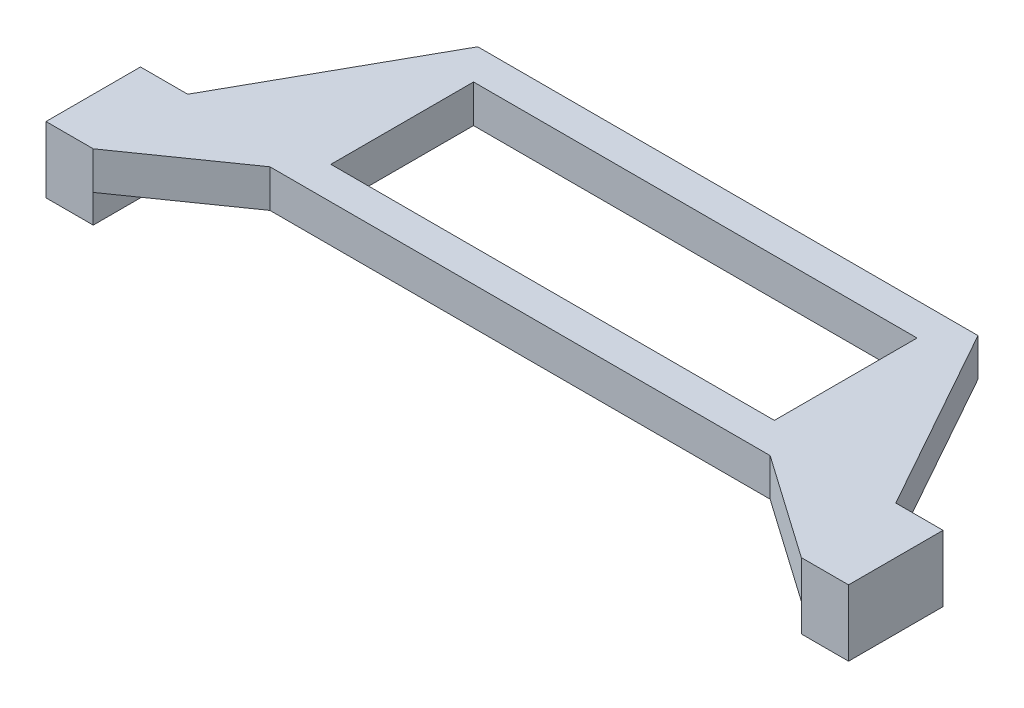
ISO-10303-21;
HEADER;
FILE_DESCRIPTION(('STEP AP214'),'2;1');
FILE_NAME('part.step','',(''),(''),'','','');
FILE_SCHEMA(('AUTOMOTIVE_DESIGN { 1 0 10303 214 1 1 1 1 }'));
ENDSEC;
DATA;
#1=APPLICATION_CONTEXT('core data for automotive mechanical design processes');
#2=APPLICATION_PROTOCOL_DEFINITION('international standard','automotive_design',2000,#1);
#3=PRODUCT_CONTEXT('',#1,'mechanical');
#4=PRODUCT('Part','Part','',(#3));
#5=PRODUCT_RELATED_PRODUCT_CATEGORY('part','',(#4));
#6=PRODUCT_DEFINITION_FORMATION('','',#4);
#7=PRODUCT_DEFINITION_CONTEXT('part definition',#1,'design');
#8=PRODUCT_DEFINITION('design','',#6,#7);
#9=PRODUCT_DEFINITION_SHAPE('','',#8);
#10=(LENGTH_UNIT() NAMED_UNIT(*) SI_UNIT(.MILLI.,.METRE.));
#11=(NAMED_UNIT(*) PLANE_ANGLE_UNIT() SI_UNIT($,.RADIAN.));
#12=(NAMED_UNIT(*) SI_UNIT($,.STERADIAN.) SOLID_ANGLE_UNIT());
#13=UNCERTAINTY_MEASURE_WITH_UNIT(LENGTH_MEASURE(1.E-05),#10,'distance_accuracy_value','');
#14=(GEOMETRIC_REPRESENTATION_CONTEXT(3) GLOBAL_UNCERTAINTY_ASSIGNED_CONTEXT((#13)) GLOBAL_UNIT_ASSIGNED_CONTEXT((#10,
#11,#12)) REPRESENTATION_CONTEXT('',''));
#15=CARTESIAN_POINT('',(0.,0.,0.));
#16=DIRECTION('',(0.,0.,1.));
#17=DIRECTION('',(1.,0.,0.));
#18=AXIS2_PLACEMENT_3D('',#15,#16,#17);
#19=CARTESIAN_POINT('',(-37.47,7.,-10.));
#20=DIRECTION('',(-1.,0.,0.));
#21=DIRECTION('',(0.,0.,1.));
#22=AXIS2_PLACEMENT_3D('',#19,#20,#21);
#23=PLANE('',#22);
#24=DIRECTION('',(0.,0.,-1.));
#25=VECTOR('',#24,1.);
#26=CARTESIAN_POINT('',(-37.47,3.,0.));
#27=LINE('',#26,#25);
#28=CARTESIAN_POINT('',(-37.47,3.,0.));
#29=VERTEX_POINT('',#28);
#30=CARTESIAN_POINT('',(-37.47,3.,-10.));
#31=VERTEX_POINT('',#30);
#32=EDGE_CURVE('E52',#29,#31,#27,.T.);
#33=ORIENTED_EDGE('',*,*,#32,.F.);
#34=DIRECTION('',(0.,-1.,0.));
#35=VECTOR('',#34,1.);
#36=CARTESIAN_POINT('',(-37.47,7.,0.));
#37=LINE('',#36,#35);
#38=CARTESIAN_POINT('',(-37.47,0.,0.));
#39=VERTEX_POINT('',#38);
#40=EDGE_CURVE('E258',#29,#39,#37,.T.);
#41=ORIENTED_EDGE('',*,*,#40,.T.);
#42=DIRECTION('',(0.,0.,-1.));
#43=VECTOR('',#42,1.);
#44=CARTESIAN_POINT('',(-37.47,0.,-10.));
#45=LINE('',#44,#43);
#46=CARTESIAN_POINT('',(-37.47,0.,-10.));
#47=VERTEX_POINT('',#46);
#48=EDGE_CURVE('E244',#39,#47,#45,.T.);
#49=ORIENTED_EDGE('',*,*,#48,.T.);
#50=DIRECTION('',(0.,-1.,0.));
#51=VECTOR('',#50,1.);
#52=CARTESIAN_POINT('',(-37.47,7.,-10.));
#53=LINE('',#52,#51);
#54=EDGE_CURVE('E249',#31,#47,#53,.T.);
#55=ORIENTED_EDGE('',*,*,#54,.F.);
#56=EDGE_LOOP('',(#33,#41,#49,#55));
#57=FACE_BOUND('',#56,.T.);
#58=ADVANCED_FACE('F35',(#57),#23,.F.);
#59=CARTESIAN_POINT('',(-42.47,7.,-10.));
#60=DIRECTION('',(1.,0.,0.));
#61=DIRECTION('',(0.,0.,-1.));
#62=AXIS2_PLACEMENT_3D('',#59,#60,#61);
#63=PLANE('',#62);
#64=DIRECTION('',(0.,0.,1.));
#65=VECTOR('',#64,1.);
#66=CARTESIAN_POINT('',(-42.47,0.,-10.));
#67=LINE('',#66,#65);
#68=CARTESIAN_POINT('',(-42.47,0.,-10.));
#69=VERTEX_POINT('',#68);
#70=CARTESIAN_POINT('',(-42.47,0.,0.));
#71=VERTEX_POINT('',#70);
#72=EDGE_CURVE('E218',#69,#71,#67,.T.);
#73=ORIENTED_EDGE('',*,*,#72,.T.);
#74=DIRECTION('',(0.,-1.,0.));
#75=VECTOR('',#74,1.);
#76=CARTESIAN_POINT('',(-42.47,7.,0.));
#77=LINE('',#76,#75);
#78=CARTESIAN_POINT('',(-42.47,7.,0.));
#79=VERTEX_POINT('',#78);
#80=EDGE_CURVE('E11',#79,#71,#77,.T.);
#81=ORIENTED_EDGE('',*,*,#80,.F.);
#82=DIRECTION('',(0.,0.,1.));
#83=VECTOR('',#82,1.);
#84=CARTESIAN_POINT('',(-42.47,7.,-10.));
#85=LINE('',#84,#83);
#86=CARTESIAN_POINT('',(-42.47,7.,-10.));
#87=VERTEX_POINT('',#86);
#88=EDGE_CURVE('E234',#87,#79,#85,.T.);
#89=ORIENTED_EDGE('',*,*,#88,.F.);
#90=DIRECTION('',(0.,-1.,0.));
#91=VECTOR('',#90,1.);
#92=CARTESIAN_POINT('',(-42.47,7.,-10.));
#93=LINE('',#92,#91);
#94=EDGE_CURVE('E238',#87,#69,#93,.T.);
#95=ORIENTED_EDGE('',*,*,#94,.T.);
#96=EDGE_LOOP('',(#73,#81,#89,#95));
#97=FACE_BOUND('',#96,.T.);
#98=ADVANCED_FACE('F37',(#97),#63,.F.);
#99=CARTESIAN_POINT('',(-42.47,7.,0.));
#100=DIRECTION('',(0.,0.,-1.));
#101=DIRECTION('',(-1.,0.,0.));
#102=AXIS2_PLACEMENT_3D('',#99,#100,#101);
#103=PLANE('',#102);
#104=DIRECTION('',(1.,0.,0.));
#105=VECTOR('',#104,1.);
#106=CARTESIAN_POINT('',(-42.47,0.,0.));
#107=LINE('',#106,#105);
#108=EDGE_CURVE('E241',#71,#39,#107,.T.);
#109=ORIENTED_EDGE('',*,*,#108,.T.);
#110=ORIENTED_EDGE('',*,*,#40,.F.);
#111=CARTESIAN_POINT('',(-37.47,7.,0.));
#112=VERTEX_POINT('',#111);
#113=EDGE_CURVE('E44',#112,#29,#37,.T.);
#114=ORIENTED_EDGE('',*,*,#113,.F.);
#115=DIRECTION('',(1.,0.,0.));
#116=VECTOR('',#115,1.);
#117=CARTESIAN_POINT('',(-42.47,7.,0.));
#118=LINE('',#117,#116);
#119=EDGE_CURVE('E87',#79,#112,#118,.T.);
#120=ORIENTED_EDGE('',*,*,#119,.F.);
#121=ORIENTED_EDGE('',*,*,#80,.T.);
#122=EDGE_LOOP('',(#109,#110,#114,#120,#121));
#123=FACE_BOUND('',#122,.T.);
#124=ADVANCED_FACE('F396',(#123),#103,.F.);
#125=CARTESIAN_POINT('',(-42.47,7.,-10.));
#126=DIRECTION('',(0.,0.,1.));
#127=DIRECTION('',(1.,0.,0.));
#128=AXIS2_PLACEMENT_3D('',#125,#126,#127);
#129=PLANE('',#128);
#130=DIRECTION('',(-1.,0.,0.));
#131=VECTOR('',#130,1.);
#132=CARTESIAN_POINT('',(-42.47,0.,-10.));
#133=LINE('',#132,#131);
#134=EDGE_CURVE('E80',#47,#69,#133,.T.);
#135=ORIENTED_EDGE('',*,*,#134,.T.);
#136=ORIENTED_EDGE('',*,*,#94,.F.);
#137=DIRECTION('',(-1.,0.,0.));
#138=VECTOR('',#137,1.);
#139=CARTESIAN_POINT('',(-42.47,7.,-10.));
#140=LINE('',#139,#138);
#141=CARTESIAN_POINT('',(-37.47,7.,-10.));
#142=VERTEX_POINT('',#141);
#143=EDGE_CURVE('E61',#142,#87,#140,.T.);
#144=ORIENTED_EDGE('',*,*,#143,.F.);
#145=EDGE_CURVE('E256',#142,#31,#53,.T.);
#146=ORIENTED_EDGE('',*,*,#145,.T.);
#147=ORIENTED_EDGE('',*,*,#54,.T.);
#148=EDGE_LOOP('',(#135,#136,#144,#146,#147));
#149=FACE_BOUND('',#148,.T.);
#150=ADVANCED_FACE('F399',(#149),#129,.F.);
#151=CARTESIAN_POINT('',(0.,7.,0.));
#152=DIRECTION('',(0.,1.,0.));
#153=DIRECTION('',(0.,0.,1.));
#154=AXIS2_PLACEMENT_3D('',#151,#152,#153);
#155=PLANE('',#154);
#156=ORIENTED_EDGE('',*,*,#88,.T.);
#157=ORIENTED_EDGE('',*,*,#119,.T.);
#158=DIRECTION('',(-0.819231920519031,0.,0.573462344363341));
#159=VECTOR('',#158,1.);
#160=CARTESIAN_POINT('',(-12.3223489932892,7.,-17.6033557046982));
#161=LINE('',#160,#159);
#162=CARTESIAN_POINT('',(-26.47,7.,-7.70000000000027));
#163=VERTEX_POINT('',#162);
#164=EDGE_CURVE('E211',#163,#112,#161,.T.);
#165=ORIENTED_EDGE('',*,*,#164,.F.);
#166=DIRECTION('',(-1.,0.,0.));
#167=VECTOR('',#166,1.);
#168=CARTESIAN_POINT('',(0.,7.,-7.70000000000027));
#169=LINE('',#168,#167);
#170=CARTESIAN_POINT('',(26.47,7.,-7.70000000000027));
#171=VERTEX_POINT('',#170);
#172=EDGE_CURVE('E196',#171,#163,#169,.T.);
#173=ORIENTED_EDGE('',*,*,#172,.F.);
#174=DIRECTION('',(0.819231920519031,0.,0.573462344363342));
#175=VECTOR('',#174,1.);
#176=CARTESIAN_POINT('',(12.3223489932892,7.,-17.6033557046982));
#177=LINE('',#176,#175);
#178=CARTESIAN_POINT('',(37.47,7.,0.));
#179=VERTEX_POINT('',#178);
#180=EDGE_CURVE('E186',#171,#179,#177,.T.);
#181=ORIENTED_EDGE('',*,*,#180,.T.);
#182=DIRECTION('',(1.,0.,0.));
#183=VECTOR('',#182,1.);
#184=CARTESIAN_POINT('',(37.47,7.,0.));
#185=LINE('',#184,#183);
#186=CARTESIAN_POINT('',(42.47,7.,0.));
#187=VERTEX_POINT('',#186);
#188=EDGE_CURVE('E170',#179,#187,#185,.T.);
#189=ORIENTED_EDGE('',*,*,#188,.T.);
#190=DIRECTION('',(0.,0.,-1.));
#191=VECTOR('',#190,1.);
#192=CARTESIAN_POINT('',(42.47,7.,-10.));
#193=LINE('',#192,#191);
#194=CARTESIAN_POINT('',(42.47,7.,-10.));
#195=VERTEX_POINT('',#194);
#196=EDGE_CURVE('E179',#187,#195,#193,.T.);
#197=ORIENTED_EDGE('',*,*,#196,.T.);
#198=DIRECTION('',(-1.,0.,0.));
#199=VECTOR('',#198,1.);
#200=CARTESIAN_POINT('',(37.47,7.,-10.));
#201=LINE('',#200,#199);
#202=CARTESIAN_POINT('',(37.47,7.,-10.));
#203=VERTEX_POINT('',#202);
#204=EDGE_CURVE('E346',#195,#203,#201,.T.);
#205=ORIENTED_EDGE('',*,*,#204,.T.);
#206=DIRECTION('',(-0.487523328524232,0.,-0.873109961084315));
#207=VECTOR('',#206,1.);
#208=CARTESIAN_POINT('',(32.8207827692551,7.,-18.3263254041524));
#209=LINE('',#208,#207);
#210=CARTESIAN_POINT('',(26.47,7.,-29.7000000000002));
#211=VERTEX_POINT('',#210);
#212=EDGE_CURVE('E197',#203,#211,#209,.T.);
#213=ORIENTED_EDGE('',*,*,#212,.T.);
#214=DIRECTION('',(-1.,0.,0.));
#215=VECTOR('',#214,1.);
#216=CARTESIAN_POINT('',(0.,7.,-29.7000000000002));
#217=LINE('',#216,#215);
#218=CARTESIAN_POINT('',(-26.47,7.,-29.7000000000002));
#219=VERTEX_POINT('',#218);
#220=EDGE_CURVE('E200',#211,#219,#217,.T.);
#221=ORIENTED_EDGE('',*,*,#220,.T.);
#222=DIRECTION('',(0.487523328524232,0.,-0.873109961084315));
#223=VECTOR('',#222,1.);
#224=CARTESIAN_POINT('',(-32.8207827692551,7.,-18.3263254041524));
#225=LINE('',#224,#223);
#226=EDGE_CURVE('E208',#142,#219,#225,.T.);
#227=ORIENTED_EDGE('',*,*,#226,.F.);
#228=ORIENTED_EDGE('',*,*,#143,.T.);
#229=EDGE_LOOP('',(#156,#157,#165,#173,#181,#189,#197,#205,#213,#221,#227,#228));
#230=FACE_BOUND('',#229,.T.);
#231=DIRECTION('',(0.,0.,1.));
#232=VECTOR('',#231,1.);
#233=CARTESIAN_POINT('',(23.47,7.,0.));
#234=LINE('',#233,#232);
#235=CARTESIAN_POINT('',(23.47,7.,-26.25));
#236=VERTEX_POINT('',#235);
#237=CARTESIAN_POINT('',(23.47,7.,-11.1500000000004));
#238=VERTEX_POINT('',#237);
#239=EDGE_CURVE('E271',#236,#238,#234,.T.);
#240=ORIENTED_EDGE('',*,*,#239,.T.);
#241=DIRECTION('',(-1.,0.,0.));
#242=VECTOR('',#241,1.);
#243=CARTESIAN_POINT('',(0.,7.,-11.1500000000004));
#244=LINE('',#243,#242);
#245=CARTESIAN_POINT('',(-23.47,7.,-11.1500000000004));
#246=VERTEX_POINT('',#245);
#247=EDGE_CURVE('E274',#238,#246,#244,.T.);
#248=ORIENTED_EDGE('',*,*,#247,.T.);
#249=DIRECTION('',(0.,0.,1.));
#250=VECTOR('',#249,1.);
#251=CARTESIAN_POINT('',(-23.47,7.,0.));
#252=LINE('',#251,#250);
#253=CARTESIAN_POINT('',(-23.47,7.,-26.25));
#254=VERTEX_POINT('',#253);
#255=EDGE_CURVE('E278',#254,#246,#252,.T.);
#256=ORIENTED_EDGE('',*,*,#255,.F.);
#257=DIRECTION('',(-1.,0.,0.));
#258=VECTOR('',#257,1.);
#259=CARTESIAN_POINT('',(0.,7.,-26.25));
#260=LINE('',#259,#258);
#261=EDGE_CURVE('E202',#236,#254,#260,.T.);
#262=ORIENTED_EDGE('',*,*,#261,.F.);
#263=EDGE_LOOP('',(#240,#248,#256,#262));
#264=FACE_BOUND('',#263,.T.);
#265=ADVANCED_FACE('F193',(#230,#264),#155,.T.);
#266=CARTESIAN_POINT('',(0.,0.,0.));
#267=DIRECTION('',(0.,1.,0.));
#268=DIRECTION('',(0.,0.,1.));
#269=AXIS2_PLACEMENT_3D('',#266,#267,#268);
#270=PLANE('',#269);
#271=ORIENTED_EDGE('',*,*,#72,.F.);
#272=ORIENTED_EDGE('',*,*,#134,.F.);
#273=ORIENTED_EDGE('',*,*,#48,.F.);
#274=ORIENTED_EDGE('',*,*,#108,.F.);
#275=EDGE_LOOP('',(#271,#272,#273,#274));
#276=FACE_BOUND('',#275,.T.);
#277=ADVANCED_FACE('F409',(#276),#270,.F.);
#278=CARTESIAN_POINT('',(0.,3.,-7.70000000000027));
#279=DIRECTION('',(0.,0.,-1.));
#280=DIRECTION('',(-1.,0.,0.));
#281=AXIS2_PLACEMENT_3D('',#278,#279,#280);
#282=PLANE('',#281);
#283=ORIENTED_EDGE('',*,*,#172,.T.);
#284=DIRECTION('',(0.,1.,0.));
#285=VECTOR('',#284,1.);
#286=CARTESIAN_POINT('',(-26.47,3.,-7.70000000000027));
#287=LINE('',#286,#285);
#288=CARTESIAN_POINT('',(-26.47,3.,-7.70000000000027));
#289=VERTEX_POINT('',#288);
#290=EDGE_CURVE('E215',#289,#163,#287,.T.);
#291=ORIENTED_EDGE('',*,*,#290,.F.);
#292=DIRECTION('',(-1.,0.,0.));
#293=VECTOR('',#292,1.);
#294=CARTESIAN_POINT('',(0.,3.,-7.70000000000027));
#295=LINE('',#294,#293);
#296=CARTESIAN_POINT('',(26.47,3.,-7.70000000000027));
#297=VERTEX_POINT('',#296);
#298=EDGE_CURVE('E308',#297,#289,#295,.T.);
#299=ORIENTED_EDGE('',*,*,#298,.F.);
#300=DIRECTION('',(0.,1.,0.));
#301=VECTOR('',#300,1.);
#302=CARTESIAN_POINT('',(26.47,3.,-7.70000000000027));
#303=LINE('',#302,#301);
#304=EDGE_CURVE('E190',#297,#171,#303,.T.);
#305=ORIENTED_EDGE('',*,*,#304,.T.);
#306=EDGE_LOOP('',(#283,#291,#299,#305));
#307=FACE_BOUND('',#306,.T.);
#308=ADVANCED_FACE('F416',(#307),#282,.F.);
#309=CARTESIAN_POINT('',(-12.3223489932892,3.,-17.6033557046982));
#310=DIRECTION('',(-0.573462344363341,0.,-0.819231920519031));
#311=DIRECTION('',(-0.819231920519031,0.,0.573462344363341));
#312=AXIS2_PLACEMENT_3D('',#309,#310,#311);
#313=PLANE('',#312);
#314=ORIENTED_EDGE('',*,*,#164,.T.);
#315=ORIENTED_EDGE('',*,*,#113,.T.);
#316=DIRECTION('',(-0.819231920519031,0.,0.573462344363341));
#317=VECTOR('',#316,1.);
#318=CARTESIAN_POINT('',(-12.3223489932892,3.,-17.6033557046982));
#319=LINE('',#318,#317);
#320=EDGE_CURVE('E233',#289,#29,#319,.T.);
#321=ORIENTED_EDGE('',*,*,#320,.F.);
#322=ORIENTED_EDGE('',*,*,#290,.T.);
#323=EDGE_LOOP('',(#314,#315,#321,#322));
#324=FACE_BOUND('',#323,.T.);
#325=ADVANCED_FACE('F412',(#324),#313,.F.);
#326=CARTESIAN_POINT('',(-32.8207827692551,3.,-18.3263254041524));
#327=DIRECTION('',(0.873109961084315,0.,0.487523328524232));
#328=DIRECTION('',(0.487523328524232,0.,-0.873109961084315));
#329=AXIS2_PLACEMENT_3D('',#326,#327,#328);
#330=PLANE('',#329);
#331=ORIENTED_EDGE('',*,*,#226,.T.);
#332=DIRECTION('',(0.,1.,0.));
#333=VECTOR('',#332,1.);
#334=CARTESIAN_POINT('',(-26.47,3.,-29.7000000000002));
#335=LINE('',#334,#333);
#336=CARTESIAN_POINT('',(-26.47,3.,-29.7000000000002));
#337=VERTEX_POINT('',#336);
#338=EDGE_CURVE('E219',#337,#219,#335,.T.);
#339=ORIENTED_EDGE('',*,*,#338,.F.);
#340=DIRECTION('',(0.487523328524232,0.,-0.873109961084315));
#341=VECTOR('',#340,1.);
#342=CARTESIAN_POINT('',(-32.8207827692551,3.,-18.3263254041524));
#343=LINE('',#342,#341);
#344=EDGE_CURVE('E264',#31,#337,#343,.T.);
#345=ORIENTED_EDGE('',*,*,#344,.F.);
#346=ORIENTED_EDGE('',*,*,#145,.F.);
#347=EDGE_LOOP('',(#331,#339,#345,#346));
#348=FACE_BOUND('',#347,.T.);
#349=ADVANCED_FACE('F341',(#348),#330,.F.);
#350=CARTESIAN_POINT('',(0.,3.,-29.7000000000002));
#351=DIRECTION('',(0.,0.,-1.));
#352=DIRECTION('',(-1.,0.,0.));
#353=AXIS2_PLACEMENT_3D('',#350,#351,#352);
#354=PLANE('',#353);
#355=ORIENTED_EDGE('',*,*,#220,.F.);
#356=DIRECTION('',(0.,1.,0.));
#357=VECTOR('',#356,1.);
#358=CARTESIAN_POINT('',(26.47,3.,-29.7000000000002));
#359=LINE('',#358,#357);
#360=CARTESIAN_POINT('',(26.47,3.,-29.7000000000002));
#361=VERTEX_POINT('',#360);
#362=EDGE_CURVE('E221',#361,#211,#359,.T.);
#363=ORIENTED_EDGE('',*,*,#362,.F.);
#364=DIRECTION('',(-1.,0.,0.));
#365=VECTOR('',#364,1.);
#366=CARTESIAN_POINT('',(0.,3.,-29.7000000000002));
#367=LINE('',#366,#365);
#368=EDGE_CURVE('E269',#361,#337,#367,.T.);
#369=ORIENTED_EDGE('',*,*,#368,.T.);
#370=ORIENTED_EDGE('',*,*,#338,.T.);
#371=EDGE_LOOP('',(#355,#363,#369,#370));
#372=FACE_BOUND('',#371,.T.);
#373=ADVANCED_FACE('F343',(#372),#354,.T.);
#374=CARTESIAN_POINT('',(32.8207827692551,3.,-18.3263254041524));
#375=DIRECTION('',(0.873109961084315,0.,-0.487523328524232));
#376=DIRECTION('',(-0.487523328524232,0.,-0.873109961084315));
#377=AXIS2_PLACEMENT_3D('',#374,#375,#376);
#378=PLANE('',#377);
#379=ORIENTED_EDGE('',*,*,#212,.F.);
#380=DIRECTION('',(0.,1.,0.));
#381=VECTOR('',#380,1.);
#382=CARTESIAN_POINT('',(37.47,3.,-10.));
#383=LINE('',#382,#381);
#384=CARTESIAN_POINT('',(37.47,3.,-10.));
#385=VERTEX_POINT('',#384);
#386=EDGE_CURVE('E189',#385,#203,#383,.T.);
#387=ORIENTED_EDGE('',*,*,#386,.F.);
#388=DIRECTION('',(-0.487523328524232,0.,-0.873109961084315));
#389=VECTOR('',#388,1.);
#390=CARTESIAN_POINT('',(32.8207827692551,3.,-18.3263254041524));
#391=LINE('',#390,#389);
#392=EDGE_CURVE('E315',#385,#361,#391,.T.);
#393=ORIENTED_EDGE('',*,*,#392,.T.);
#394=ORIENTED_EDGE('',*,*,#362,.T.);
#395=EDGE_LOOP('',(#379,#387,#393,#394));
#396=FACE_BOUND('',#395,.T.);
#397=ADVANCED_FACE('F347',(#396),#378,.T.);
#398=CARTESIAN_POINT('',(23.47,3.,0.));
#399=DIRECTION('',(-1.,0.,0.));
#400=DIRECTION('',(0.,0.,1.));
#401=AXIS2_PLACEMENT_3D('',#398,#399,#400);
#402=PLANE('',#401);
#403=ORIENTED_EDGE('',*,*,#239,.F.);
#404=DIRECTION('',(0.,1.,0.));
#405=VECTOR('',#404,1.);
#406=CARTESIAN_POINT('',(23.47,3.,-26.25));
#407=LINE('',#406,#405);
#408=CARTESIAN_POINT('',(23.47,3.,-26.25));
#409=VERTEX_POINT('',#408);
#410=EDGE_CURVE('E224',#409,#236,#407,.T.);
#411=ORIENTED_EDGE('',*,*,#410,.F.);
#412=DIRECTION('',(0.,0.,1.));
#413=VECTOR('',#412,1.);
#414=CARTESIAN_POINT('',(23.47,3.,0.));
#415=LINE('',#414,#413);
#416=CARTESIAN_POINT('',(23.47,3.,-11.1500000000004));
#417=VERTEX_POINT('',#416);
#418=EDGE_CURVE('E214',#409,#417,#415,.T.);
#419=ORIENTED_EDGE('',*,*,#418,.T.);
#420=DIRECTION('',(0.,1.,0.));
#421=VECTOR('',#420,1.);
#422=CARTESIAN_POINT('',(23.47,3.,-11.1500000000004));
#423=LINE('',#422,#421);
#424=EDGE_CURVE('E231',#417,#238,#423,.T.);
#425=ORIENTED_EDGE('',*,*,#424,.T.);
#426=EDGE_LOOP('',(#403,#411,#419,#425));
#427=FACE_BOUND('',#426,.T.);
#428=ADVANCED_FACE('F430',(#427),#402,.T.);
#429=CARTESIAN_POINT('',(0.,3.,-26.25));
#430=DIRECTION('',(0.,0.,-1.));
#431=DIRECTION('',(-1.,0.,0.));
#432=AXIS2_PLACEMENT_3D('',#429,#430,#431);
#433=PLANE('',#432);
#434=ORIENTED_EDGE('',*,*,#261,.T.);
#435=DIRECTION('',(0.,1.,0.));
#436=VECTOR('',#435,1.);
#437=CARTESIAN_POINT('',(-23.47,3.,-26.25));
#438=LINE('',#437,#436);
#439=CARTESIAN_POINT('',(-23.47,3.,-26.25));
#440=VERTEX_POINT('',#439);
#441=EDGE_CURVE('E226',#440,#254,#438,.T.);
#442=ORIENTED_EDGE('',*,*,#441,.F.);
#443=DIRECTION('',(-1.,0.,0.));
#444=VECTOR('',#443,1.);
#445=CARTESIAN_POINT('',(0.,3.,-26.25));
#446=LINE('',#445,#444);
#447=EDGE_CURVE('E302',#409,#440,#446,.T.);
#448=ORIENTED_EDGE('',*,*,#447,.F.);
#449=ORIENTED_EDGE('',*,*,#410,.T.);
#450=EDGE_LOOP('',(#434,#442,#448,#449));
#451=FACE_BOUND('',#450,.T.);
#452=ADVANCED_FACE('F283',(#451),#433,.F.);
#453=CARTESIAN_POINT('',(-23.47,3.,0.));
#454=DIRECTION('',(-1.,0.,0.));
#455=DIRECTION('',(0.,0.,1.));
#456=AXIS2_PLACEMENT_3D('',#453,#454,#455);
#457=PLANE('',#456);
#458=ORIENTED_EDGE('',*,*,#255,.T.);
#459=DIRECTION('',(0.,1.,0.));
#460=VECTOR('',#459,1.);
#461=CARTESIAN_POINT('',(-23.47,3.,-11.1500000000004));
#462=LINE('',#461,#460);
#463=CARTESIAN_POINT('',(-23.47,3.,-11.1500000000004));
#464=VERTEX_POINT('',#463);
#465=EDGE_CURVE('E229',#464,#246,#462,.T.);
#466=ORIENTED_EDGE('',*,*,#465,.F.);
#467=DIRECTION('',(0.,0.,1.));
#468=VECTOR('',#467,1.);
#469=CARTESIAN_POINT('',(-23.47,3.,0.));
#470=LINE('',#469,#468);
#471=EDGE_CURVE('E291',#440,#464,#470,.T.);
#472=ORIENTED_EDGE('',*,*,#471,.F.);
#473=ORIENTED_EDGE('',*,*,#441,.T.);
#474=EDGE_LOOP('',(#458,#466,#472,#473));
#475=FACE_BOUND('',#474,.T.);
#476=ADVANCED_FACE('F289',(#475),#457,.F.);
#477=CARTESIAN_POINT('',(0.,3.,-11.1500000000004));
#478=DIRECTION('',(0.,0.,-1.));
#479=DIRECTION('',(-1.,0.,0.));
#480=AXIS2_PLACEMENT_3D('',#477,#478,#479);
#481=PLANE('',#480);
#482=ORIENTED_EDGE('',*,*,#247,.F.);
#483=ORIENTED_EDGE('',*,*,#424,.F.);
#484=DIRECTION('',(-1.,0.,0.));
#485=VECTOR('',#484,1.);
#486=CARTESIAN_POINT('',(0.,3.,-11.1500000000004));
#487=LINE('',#486,#485);
#488=EDGE_CURVE('E297',#417,#464,#487,.T.);
#489=ORIENTED_EDGE('',*,*,#488,.T.);
#490=ORIENTED_EDGE('',*,*,#465,.T.);
#491=EDGE_LOOP('',(#482,#483,#489,#490));
#492=FACE_BOUND('',#491,.T.);
#493=ADVANCED_FACE('F294',(#492),#481,.T.);
#494=CARTESIAN_POINT('',(12.3223489932892,3.,-17.6033557046982));
#495=DIRECTION('',(-0.573462344363342,0.,0.819231920519031));
#496=DIRECTION('',(0.819231920519031,0.,0.573462344363342));
#497=AXIS2_PLACEMENT_3D('',#494,#495,#496);
#498=PLANE('',#497);
#499=ORIENTED_EDGE('',*,*,#180,.F.);
#500=ORIENTED_EDGE('',*,*,#304,.F.);
#501=DIRECTION('',(0.819231920519031,0.,0.573462344363342));
#502=VECTOR('',#501,1.);
#503=CARTESIAN_POINT('',(12.3223489932892,3.,-17.6033557046982));
#504=LINE('',#503,#502);
#505=CARTESIAN_POINT('',(37.47,3.,0.));
#506=VERTEX_POINT('',#505);
#507=EDGE_CURVE('E188',#297,#506,#504,.T.);
#508=ORIENTED_EDGE('',*,*,#507,.T.);
#509=DIRECTION('',(0.,1.,0.));
#510=VECTOR('',#509,1.);
#511=CARTESIAN_POINT('',(37.47,3.,0.));
#512=LINE('',#511,#510);
#513=EDGE_CURVE('E173',#506,#179,#512,.T.);
#514=ORIENTED_EDGE('',*,*,#513,.T.);
#515=EDGE_LOOP('',(#499,#500,#508,#514));
#516=FACE_BOUND('',#515,.T.);
#517=ADVANCED_FACE('F185',(#516),#498,.T.);
#518=CARTESIAN_POINT('',(0.,3.,0.));
#519=DIRECTION('',(0.,1.,0.));
#520=DIRECTION('',(0.,0.,1.));
#521=AXIS2_PLACEMENT_3D('',#518,#519,#520);
#522=PLANE('',#521);
#523=ORIENTED_EDGE('',*,*,#418,.F.);
#524=ORIENTED_EDGE('',*,*,#447,.T.);
#525=ORIENTED_EDGE('',*,*,#471,.T.);
#526=ORIENTED_EDGE('',*,*,#488,.F.);
#527=EDGE_LOOP('',(#523,#524,#525,#526));
#528=FACE_BOUND('',#527,.T.);
#529=ORIENTED_EDGE('',*,*,#298,.T.);
#530=ORIENTED_EDGE('',*,*,#320,.T.);
#531=ORIENTED_EDGE('',*,*,#32,.T.);
#532=ORIENTED_EDGE('',*,*,#344,.T.);
#533=ORIENTED_EDGE('',*,*,#368,.F.);
#534=ORIENTED_EDGE('',*,*,#392,.F.);
#535=DIRECTION('',(0.,0.,1.));
#536=VECTOR('',#535,1.);
#537=CARTESIAN_POINT('',(37.47,3.,0.));
#538=LINE('',#537,#536);
#539=EDGE_CURVE('E312',#385,#506,#538,.T.);
#540=ORIENTED_EDGE('',*,*,#539,.T.);
#541=ORIENTED_EDGE('',*,*,#507,.F.);
#542=EDGE_LOOP('',(#529,#530,#531,#532,#533,#534,#540,#541));
#543=FACE_BOUND('',#542,.T.);
#544=ADVANCED_FACE('F337',(#528,#543),#522,.F.);
#545=CARTESIAN_POINT('',(37.47,7.,-10.));
#546=DIRECTION('',(1.,0.,0.));
#547=DIRECTION('',(0.,0.,-1.));
#548=AXIS2_PLACEMENT_3D('',#545,#546,#547);
#549=PLANE('',#548);
#550=ORIENTED_EDGE('',*,*,#539,.F.);
#551=DIRECTION('',(0.,-1.,0.));
#552=VECTOR('',#551,1.);
#553=CARTESIAN_POINT('',(37.47,7.,-10.));
#554=LINE('',#553,#552);
#555=CARTESIAN_POINT('',(37.47,0.,-10.));
#556=VERTEX_POINT('',#555);
#557=EDGE_CURVE('E353',#385,#556,#554,.T.);
#558=ORIENTED_EDGE('',*,*,#557,.T.);
#559=DIRECTION('',(0.,0.,1.));
#560=VECTOR('',#559,1.);
#561=CARTESIAN_POINT('',(37.47,0.,-10.));
#562=LINE('',#561,#560);
#563=CARTESIAN_POINT('',(37.47,0.,0.));
#564=VERTEX_POINT('',#563);
#565=EDGE_CURVE('E376',#556,#564,#562,.T.);
#566=ORIENTED_EDGE('',*,*,#565,.T.);
#567=DIRECTION('',(0.,-1.,0.));
#568=VECTOR('',#567,1.);
#569=CARTESIAN_POINT('',(37.47,7.,0.));
#570=LINE('',#569,#568);
#571=EDGE_CURVE('E275',#506,#564,#570,.T.);
#572=ORIENTED_EDGE('',*,*,#571,.F.);
#573=EDGE_LOOP('',(#550,#558,#566,#572));
#574=FACE_BOUND('',#573,.T.);
#575=ADVANCED_FACE('F351',(#574),#549,.F.);
#576=CARTESIAN_POINT('',(37.47,7.,0.));
#577=DIRECTION('',(0.,0.,-1.));
#578=DIRECTION('',(-1.,0.,0.));
#579=AXIS2_PLACEMENT_3D('',#576,#577,#578);
#580=PLANE('',#579);
#581=DIRECTION('',(1.,0.,0.));
#582=VECTOR('',#581,1.);
#583=CARTESIAN_POINT('',(37.47,0.,0.));
#584=LINE('',#583,#582);
#585=CARTESIAN_POINT('',(42.47,0.,0.));
#586=VERTEX_POINT('',#585);
#587=EDGE_CURVE('E373',#564,#586,#584,.T.);
#588=ORIENTED_EDGE('',*,*,#587,.T.);
#589=DIRECTION('',(0.,-1.,0.));
#590=VECTOR('',#589,1.);
#591=CARTESIAN_POINT('',(42.47,7.,0.));
#592=LINE('',#591,#590);
#593=EDGE_CURVE('E176',#187,#586,#592,.T.);
#594=ORIENTED_EDGE('',*,*,#593,.F.);
#595=ORIENTED_EDGE('',*,*,#188,.F.);
#596=ORIENTED_EDGE('',*,*,#513,.F.);
#597=ORIENTED_EDGE('',*,*,#571,.T.);
#598=EDGE_LOOP('',(#588,#594,#595,#596,#597));
#599=FACE_BOUND('',#598,.T.);
#600=ADVANCED_FACE('F172',(#599),#580,.F.);
#601=CARTESIAN_POINT('',(42.47,7.,-10.));
#602=DIRECTION('',(-1.,0.,0.));
#603=DIRECTION('',(0.,0.,1.));
#604=AXIS2_PLACEMENT_3D('',#601,#602,#603);
#605=PLANE('',#604);
#606=DIRECTION('',(0.,0.,-1.));
#607=VECTOR('',#606,1.);
#608=CARTESIAN_POINT('',(42.47,0.,-10.));
#609=LINE('',#608,#607);
#610=CARTESIAN_POINT('',(42.47,0.,-10.));
#611=VERTEX_POINT('',#610);
#612=EDGE_CURVE('E377',#586,#611,#609,.T.);
#613=ORIENTED_EDGE('',*,*,#612,.T.);
#614=DIRECTION('',(0.,-1.,0.));
#615=VECTOR('',#614,1.);
#616=CARTESIAN_POINT('',(42.47,7.,-10.));
#617=LINE('',#616,#615);
#618=EDGE_CURVE('E359',#195,#611,#617,.T.);
#619=ORIENTED_EDGE('',*,*,#618,.F.);
#620=ORIENTED_EDGE('',*,*,#196,.F.);
#621=ORIENTED_EDGE('',*,*,#593,.T.);
#622=EDGE_LOOP('',(#613,#619,#620,#621));
#623=FACE_BOUND('',#622,.T.);
#624=ADVANCED_FACE('F382',(#623),#605,.F.);
#625=CARTESIAN_POINT('',(37.47,7.,-10.));
#626=DIRECTION('',(0.,0.,1.));
#627=DIRECTION('',(1.,0.,0.));
#628=AXIS2_PLACEMENT_3D('',#625,#626,#627);
#629=PLANE('',#628);
#630=DIRECTION('',(-1.,0.,0.));
#631=VECTOR('',#630,1.);
#632=CARTESIAN_POINT('',(37.47,0.,-10.));
#633=LINE('',#632,#631);
#634=EDGE_CURVE('E180',#611,#556,#633,.T.);
#635=ORIENTED_EDGE('',*,*,#634,.T.);
#636=ORIENTED_EDGE('',*,*,#557,.F.);
#637=ORIENTED_EDGE('',*,*,#386,.T.);
#638=ORIENTED_EDGE('',*,*,#204,.F.);
#639=ORIENTED_EDGE('',*,*,#618,.T.);
#640=EDGE_LOOP('',(#635,#636,#637,#638,#639));
#641=FACE_BOUND('',#640,.T.);
#642=ADVANCED_FACE('F355',(#641),#629,.F.);
#643=CARTESIAN_POINT('',(0.,0.,0.));
#644=DIRECTION('',(0.,1.,0.));
#645=DIRECTION('',(0.,0.,1.));
#646=AXIS2_PLACEMENT_3D('',#643,#644,#645);
#647=PLANE('',#646);
#648=ORIENTED_EDGE('',*,*,#565,.F.);
#649=ORIENTED_EDGE('',*,*,#634,.F.);
#650=ORIENTED_EDGE('',*,*,#612,.F.);
#651=ORIENTED_EDGE('',*,*,#587,.F.);
#652=EDGE_LOOP('',(#648,#649,#650,#651));
#653=FACE_BOUND('',#652,.T.);
#654=ADVANCED_FACE('F375',(#653),#647,.F.);
#655=CLOSED_SHELL('',(#58,#98,#124,#150,#265,#277,#308,#325,#349,#373,#397,#428,#452,#476,#493,
#517,#544,#575,#600,#624,#642,#654));
#656=MANIFOLD_SOLID_BREP('B2',#655);
#657=ADVANCED_BREP_SHAPE_REPRESENTATION('',(#18,#656),#14);
#658=SHAPE_DEFINITION_REPRESENTATION(#9,#657);
ENDSEC;
END-ISO-10303-21;
